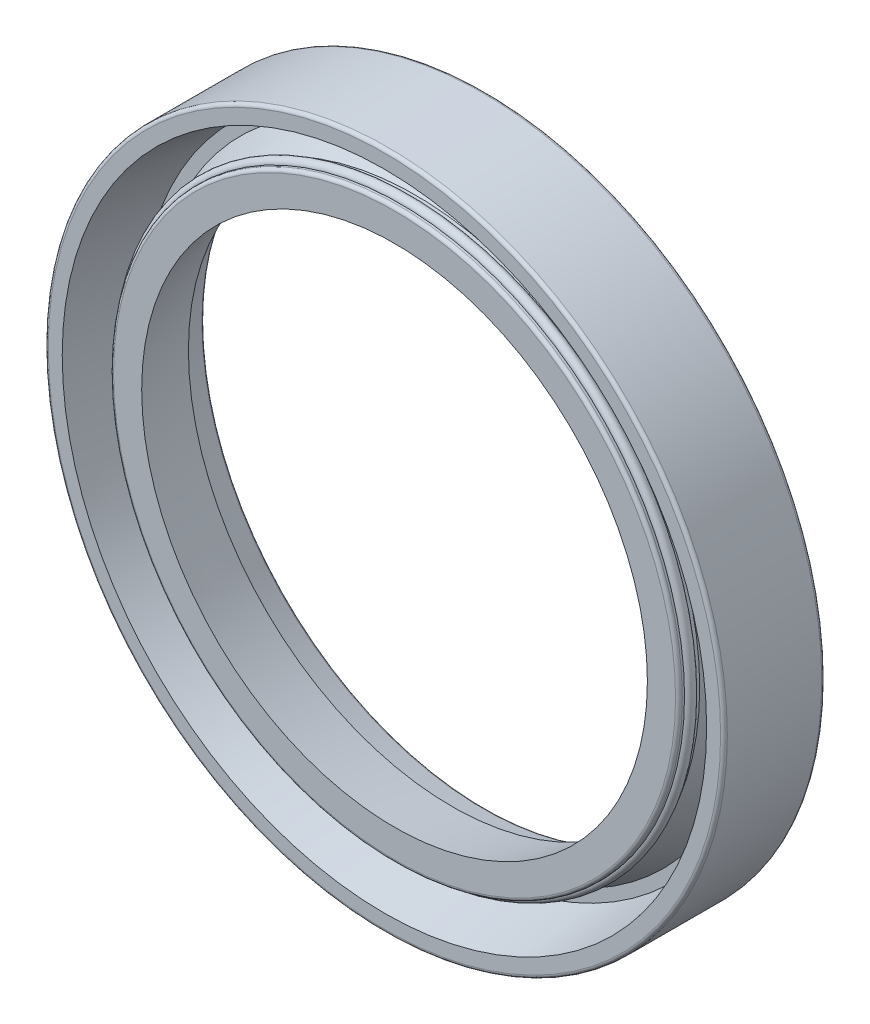
ISO-10303-21;
HEADER;
FILE_DESCRIPTION(('STEP AP214'),'2;1');
FILE_NAME('part.step','',(''),(''),'','','');
FILE_SCHEMA(('AUTOMOTIVE_DESIGN { 1 0 10303 214 1 1 1 1 }'));
ENDSEC;
DATA;
#1=APPLICATION_CONTEXT('core data for automotive mechanical design processes');
#2=APPLICATION_PROTOCOL_DEFINITION('international standard','automotive_design',2000,#1);
#3=PRODUCT_CONTEXT('',#1,'mechanical');
#4=PRODUCT('Part','Part','',(#3));
#5=PRODUCT_RELATED_PRODUCT_CATEGORY('part','',(#4));
#6=PRODUCT_DEFINITION_FORMATION('','',#4);
#7=PRODUCT_DEFINITION_CONTEXT('part definition',#1,'design');
#8=PRODUCT_DEFINITION('design','',#6,#7);
#9=PRODUCT_DEFINITION_SHAPE('','',#8);
#10=(LENGTH_UNIT() NAMED_UNIT(*) SI_UNIT(.MILLI.,.METRE.));
#11=(NAMED_UNIT(*) PLANE_ANGLE_UNIT() SI_UNIT($,.RADIAN.));
#12=(NAMED_UNIT(*) SI_UNIT($,.STERADIAN.) SOLID_ANGLE_UNIT());
#13=UNCERTAINTY_MEASURE_WITH_UNIT(LENGTH_MEASURE(1.E-05),#10,'distance_accuracy_value','');
#14=(GEOMETRIC_REPRESENTATION_CONTEXT(3) GLOBAL_UNCERTAINTY_ASSIGNED_CONTEXT((#13)) GLOBAL_UNIT_ASSIGNED_CONTEXT((#10,
#11,#12)) REPRESENTATION_CONTEXT('',''));
#15=CARTESIAN_POINT('',(0.,0.,0.));
#16=DIRECTION('',(0.,0.,1.));
#17=DIRECTION('',(1.,0.,0.));
#18=AXIS2_PLACEMENT_3D('',#15,#16,#17);
#19=CARTESIAN_POINT('',(0.,0.,-2.33333333333332));
#20=DIRECTION('',(0.,0.,1.));
#21=DIRECTION('',(1.,0.,0.));
#22=AXIS2_PLACEMENT_3D('',#19,#20,#21);
#23=CONICAL_SURFACE('',#22,21.9,0.169778273968339);
#24=CARTESIAN_POINT('',(0.,0.,-4.66666666666666));
#25=DIRECTION('',(0.,0.,-1.));
#26=DIRECTION('',(1.,0.,0.));
#27=AXIS2_PLACEMENT_3D('',#24,#25,#26);
#28=CIRCLE('',#27,21.5);
#29=CARTESIAN_POINT('',(-21.5,0.,-4.66666666666666));
#30=VERTEX_POINT('',#29);
#31=EDGE_CURVE('E28',#30,#30,#28,.T.);
#32=ORIENTED_EDGE('',*,*,#31,.T.);
#33=DIRECTION('',(-0.168963815110846,0.,0.985622254813267));
#34=VECTOR('',#33,1.);
#35=CARTESIAN_POINT('',(-21.9,0.,-2.33333333333332));
#36=LINE('',#35,#34);
#37=CARTESIAN_POINT('',(-22.3,0.,0.));
#38=VERTEX_POINT('',#37);
#39=EDGE_CURVE('E11',#30,#38,#36,.T.);
#40=ORIENTED_EDGE('',*,*,#39,.T.);
#41=CARTESIAN_POINT('',(0.,0.,0.));
#42=DIRECTION('',(0.,0.,-1.));
#43=DIRECTION('',(1.,0.,0.));
#44=AXIS2_PLACEMENT_3D('',#41,#42,#43);
#45=CIRCLE('',#44,22.3);
#46=EDGE_CURVE('E219',#38,#38,#45,.T.);
#47=ORIENTED_EDGE('',*,*,#46,.F.);
#48=ORIENTED_EDGE('',*,*,#39,.F.);
#49=EDGE_LOOP('',(#32,#40,#47,#48));
#50=FACE_BOUND('',#49,.T.);
#51=ADVANCED_FACE('F17',(#50),#23,.F.);
#52=CARTESIAN_POINT('',(21.1,0.,-4.66666666666666));
#53=DIRECTION('',(0.,0.,1.));
#54=DIRECTION('',(1.,0.,0.));
#55=AXIS2_PLACEMENT_3D('',#52,#53,#54);
#56=PLANE('',#55);
#57=CARTESIAN_POINT('',(0.,0.,-4.66666666666666));
#58=DIRECTION('',(0.,0.,-1.));
#59=DIRECTION('',(1.,0.,0.));
#60=AXIS2_PLACEMENT_3D('',#57,#58,#59);
#61=CIRCLE('',#60,20.7);
#62=CARTESIAN_POINT('',(-20.7,0.,-4.66666666666666));
#63=VERTEX_POINT('',#62);
#64=EDGE_CURVE('E221',#63,#63,#61,.T.);
#65=ORIENTED_EDGE('',*,*,#64,.T.);
#66=EDGE_LOOP('',(#65));
#67=FACE_BOUND('',#66,.T.);
#68=ORIENTED_EDGE('',*,*,#31,.F.);
#69=EDGE_LOOP('',(#68));
#70=FACE_BOUND('',#69,.T.);
#71=ADVANCED_FACE('F516',(#67,#70),#56,.T.);
#72=CARTESIAN_POINT('',(0.,0.,-3.40277777777777));
#73=DIRECTION('',(0.,0.,-1.));
#74=DIRECTION('',(1.,0.,0.));
#75=AXIS2_PLACEMENT_3D('',#72,#73,#74);
#76=CONICAL_SURFACE('',#75,20.1909090909091,0.382915430510309);
#77=ORIENTED_EDGE('',*,*,#64,.F.);
#78=DIRECTION('',(0.373626346428202,0.,0.927579297556124));
#79=VECTOR('',#78,1.);
#80=CARTESIAN_POINT('',(-20.1909090909091,0.,-3.40277777777777));
#81=LINE('',#80,#79);
#82=CARTESIAN_POINT('',(-19.6818181818182,0.,-2.13888888888888));
#83=VERTEX_POINT('',#82);
#84=EDGE_CURVE('E224',#63,#83,#81,.T.);
#85=ORIENTED_EDGE('',*,*,#84,.T.);
#86=CARTESIAN_POINT('',(0.,0.,-2.13888888888888));
#87=DIRECTION('',(0.,0.,-1.));
#88=DIRECTION('',(1.,0.,0.));
#89=AXIS2_PLACEMENT_3D('',#86,#87,#88);
#90=CIRCLE('',#89,19.6818181818182);
#91=EDGE_CURVE('E250',#83,#83,#90,.T.);
#92=ORIENTED_EDGE('',*,*,#91,.T.);
#93=ORIENTED_EDGE('',*,*,#84,.F.);
#94=EDGE_LOOP('',(#77,#85,#92,#93));
#95=FACE_BOUND('',#94,.T.);
#96=ADVANCED_FACE('F508',(#95),#76,.T.);
#97=CARTESIAN_POINT('',(0.,0.,-1.96388888888888));
#98=DIRECTION('',(0.,0.,-1.));
#99=DIRECTION('',(1.,0.,0.));
#100=AXIS2_PLACEMENT_3D('',#97,#98,#99);
#101=CYLINDRICAL_SURFACE('',#100,19.6818181818182);
#102=ORIENTED_EDGE('',*,*,#91,.F.);
#103=DIRECTION('',(0.,0.,1.));
#104=VECTOR('',#103,1.);
#105=CARTESIAN_POINT('',(-19.6818181818182,0.,-1.96388888888888));
#106=LINE('',#105,#104);
#107=CARTESIAN_POINT('',(-19.6818181818182,0.,-1.78888888888888));
#108=VERTEX_POINT('',#107);
#109=EDGE_CURVE('E225',#83,#108,#106,.T.);
#110=ORIENTED_EDGE('',*,*,#109,.T.);
#111=CARTESIAN_POINT('',(0.,0.,-1.78888888888888));
#112=DIRECTION('',(0.,0.,-1.));
#113=DIRECTION('',(1.,0.,0.));
#114=AXIS2_PLACEMENT_3D('',#111,#112,#113);
#115=CIRCLE('',#114,19.6818181818182);
#116=CARTESIAN_POINT('',(19.6818181818182,0.,-1.78888888888888));
#117=VERTEX_POINT('',#116);
#118=EDGE_CURVE('E231',#108,#117,#115,.T.);
#119=ORIENTED_EDGE('',*,*,#118,.T.);
#120=CARTESIAN_POINT('',(0.,0.,-1.78888888888888));
#121=DIRECTION('',(0.,0.,-1.));
#122=DIRECTION('',(1.,0.,0.));
#123=AXIS2_PLACEMENT_3D('',#120,#121,#122);
#124=CIRCLE('',#123,19.6818181818182);
#125=EDGE_CURVE('E218',#117,#108,#124,.T.);
#126=ORIENTED_EDGE('',*,*,#125,.T.);
#127=ORIENTED_EDGE('',*,*,#109,.F.);
#128=EDGE_LOOP('',(#102,#110,#119,#126,#127));
#129=FACE_BOUND('',#128,.T.);
#130=ADVANCED_FACE('F277',(#129),#101,.T.);
#131=CARTESIAN_POINT('',(0.,0.,-1.43888888888888));
#132=DIRECTION('',(0.,0.,-1.));
#133=DIRECTION('',(-1.,0.,0.));
#134=AXIS2_PLACEMENT_3D('',#131,#132,#133);
#135=TOROIDAL_SURFACE('',#134,19.6818181818182,0.35);
#136=ORIENTED_EDGE('',*,*,#125,.F.);
#137=CARTESIAN_POINT('',(19.6818181818182,0.,-1.43888888888888));
#138=DIRECTION('',(0.,-1.,0.));
#139=DIRECTION('',(1.,0.,0.));
#140=AXIS2_PLACEMENT_3D('',#137,#138,#139);
#141=CIRCLE('',#140,0.35);
#142=CARTESIAN_POINT('',(19.6818181818182,0.,-1.08888888888888));
#143=VERTEX_POINT('',#142);
#144=EDGE_CURVE('E149',#117,#143,#141,.T.);
#145=ORIENTED_EDGE('',*,*,#144,.T.);
#146=CARTESIAN_POINT('',(0.,0.,-1.08888888888888));
#147=DIRECTION('',(0.,0.,-1.));
#148=DIRECTION('',(1.,0.,0.));
#149=AXIS2_PLACEMENT_3D('',#146,#147,#148);
#150=CIRCLE('',#149,19.6818181818182);
#151=CARTESIAN_POINT('',(-19.6818181818182,0.,-1.08888888888888));
#152=VERTEX_POINT('',#151);
#153=EDGE_CURVE('E134',#143,#152,#150,.T.);
#154=ORIENTED_EDGE('',*,*,#153,.T.);
#155=CARTESIAN_POINT('',(0.,0.,-1.08888888888888));
#156=DIRECTION('',(0.,0.,-1.));
#157=DIRECTION('',(1.,0.,0.));
#158=AXIS2_PLACEMENT_3D('',#155,#156,#157);
#159=CIRCLE('',#158,19.6818181818182);
#160=EDGE_CURVE('E140',#152,#143,#159,.T.);
#161=ORIENTED_EDGE('',*,*,#160,.T.);
#162=ORIENTED_EDGE('',*,*,#144,.F.);
#163=ORIENTED_EDGE('',*,*,#118,.F.);
#164=EDGE_LOOP('',(#136,#145,#154,#161,#162,#163));
#165=FACE_BOUND('',#164,.T.);
#166=ADVANCED_FACE('F148',(#165),#135,.T.);
#167=CARTESIAN_POINT('',(0.,0.,-2.68333333333332));
#168=DIRECTION('',(0.,0.,-1.));
#169=DIRECTION('',(1.,0.,0.));
#170=AXIS2_PLACEMENT_3D('',#167,#168,#169);
#171=CONICAL_SURFACE('',#170,17.8666666666667,0.182809884379604);
#172=CARTESIAN_POINT('',(0.,0.,-4.66666666666665));
#173=DIRECTION('',(0.,0.,-1.));
#174=DIRECTION('',(1.,0.,0.));
#175=AXIS2_PLACEMENT_3D('',#172,#173,#174);
#176=CIRCLE('',#175,18.2333333333333);
#177=CARTESIAN_POINT('',(-18.2333333333333,0.,-4.66666666666665));
#178=VERTEX_POINT('',#177);
#179=EDGE_CURVE('E168',#178,#178,#176,.T.);
#180=ORIENTED_EDGE('',*,*,#179,.T.);
#181=DIRECTION('',(0.181793350053274,0.,0.983336757106337));
#182=VECTOR('',#181,1.);
#183=CARTESIAN_POINT('',(-17.8666666666667,0.,-2.68333333333332));
#184=LINE('',#183,#182);
#185=CARTESIAN_POINT('',(-17.5,0.,-0.699999999999988));
#186=VERTEX_POINT('',#185);
#187=EDGE_CURVE('E216',#178,#186,#184,.T.);
#188=ORIENTED_EDGE('',*,*,#187,.T.);
#189=CARTESIAN_POINT('',(0.,0.,-0.699999999999989));
#190=DIRECTION('',(0.,0.,-1.));
#191=DIRECTION('',(1.,0.,0.));
#192=AXIS2_PLACEMENT_3D('',#189,#190,#191);
#193=CIRCLE('',#192,17.5);
#194=EDGE_CURVE('E151',#186,#186,#193,.T.);
#195=ORIENTED_EDGE('',*,*,#194,.F.);
#196=ORIENTED_EDGE('',*,*,#187,.F.);
#197=EDGE_LOOP('',(#180,#188,#195,#196));
#198=FACE_BOUND('',#197,.T.);
#199=ADVANCED_FACE('F485',(#198),#171,.F.);
#200=CARTESIAN_POINT('',(22.9,0.,0.));
#201=DIRECTION('',(0.,0.,1.));
#202=DIRECTION('',(1.,0.,0.));
#203=AXIS2_PLACEMENT_3D('',#200,#201,#202);
#204=PLANE('',#203);
#205=ORIENTED_EDGE('',*,*,#46,.T.);
#206=EDGE_LOOP('',(#205));
#207=FACE_BOUND('',#206,.T.);
#208=CARTESIAN_POINT('',(0.,0.,0.));
#209=DIRECTION('',(0.,0.,-1.));
#210=DIRECTION('',(-1.,0.,0.));
#211=AXIS2_PLACEMENT_3D('',#208,#209,#210);
#212=CIRCLE('',#211,23.2666666666667);
#213=CARTESIAN_POINT('',(23.2666666666667,0.,0.));
#214=VERTEX_POINT('',#213);
#215=EDGE_CURVE('E255',#214,#214,#212,.T.);
#216=ORIENTED_EDGE('',*,*,#215,.F.);
#217=EDGE_LOOP('',(#216));
#218=FACE_BOUND('',#217,.T.);
#219=ADVANCED_FACE('F478',(#207,#218),#204,.T.);
#220=CARTESIAN_POINT('',(0.,0.,-0.233333333333323));
#221=DIRECTION('',(0.,0.,-1.));
#222=DIRECTION('',(-1.,0.,0.));
#223=AXIS2_PLACEMENT_3D('',#220,#221,#222);
#224=TOROIDAL_SURFACE('',#223,23.2666666666667,0.233333333333333);
#225=CARTESIAN_POINT('',(0.,0.,-0.233333333333323));
#226=DIRECTION('',(0.,0.,1.));
#227=DIRECTION('',(-1.,0.,0.));
#228=AXIS2_PLACEMENT_3D('',#225,#226,#227);
#229=CIRCLE('',#228,23.5);
#230=CARTESIAN_POINT('',(23.5,0.,-0.233333333333323));
#231=VERTEX_POINT('',#230);
#232=CARTESIAN_POINT('',(-23.5,0.,-0.233333333333323));
#233=VERTEX_POINT('',#232);
#234=EDGE_CURVE('E174',#231,#233,#229,.T.);
#235=ORIENTED_EDGE('',*,*,#234,.T.);
#236=CARTESIAN_POINT('',(0.,0.,-0.233333333333323));
#237=DIRECTION('',(0.,0.,1.));
#238=DIRECTION('',(-1.,0.,0.));
#239=AXIS2_PLACEMENT_3D('',#236,#237,#238);
#240=CIRCLE('',#239,23.5);
#241=EDGE_CURVE('E243',#233,#231,#240,.T.);
#242=ORIENTED_EDGE('',*,*,#241,.T.);
#243=CARTESIAN_POINT('',(23.2666666666667,0.,-0.233333333333323));
#244=DIRECTION('',(0.,-1.,0.));
#245=DIRECTION('',(1.,0.,0.));
#246=AXIS2_PLACEMENT_3D('',#243,#244,#245);
#247=CIRCLE('',#246,0.233333333333333);
#248=EDGE_CURVE('E162',#231,#214,#247,.T.);
#249=ORIENTED_EDGE('',*,*,#248,.T.);
#250=ORIENTED_EDGE('',*,*,#215,.T.);
#251=ORIENTED_EDGE('',*,*,#248,.F.);
#252=EDGE_LOOP('',(#235,#242,#249,#250,#251));
#253=FACE_BOUND('',#252,.T.);
#254=ADVANCED_FACE('F19',(#253),#224,.T.);
#255=CARTESIAN_POINT('',(0.,0.,-3.5));
#256=DIRECTION('',(0.,0.,-1.));
#257=DIRECTION('',(1.,0.,0.));
#258=AXIS2_PLACEMENT_3D('',#255,#256,#257);
#259=CYLINDRICAL_SURFACE('',#258,23.5);
#260=CARTESIAN_POINT('',(0.,0.,-6.76666666666666));
#261=DIRECTION('',(0.,0.,-1.));
#262=DIRECTION('',(-1.,0.,0.));
#263=AXIS2_PLACEMENT_3D('',#260,#261,#262);
#264=CIRCLE('',#263,23.5);
#265=CARTESIAN_POINT('',(23.5,0.,-6.76666666666666));
#266=VERTEX_POINT('',#265);
#267=CARTESIAN_POINT('',(-23.5,0.,-6.76666666666666));
#268=VERTEX_POINT('',#267);
#269=EDGE_CURVE('E215',#266,#268,#264,.T.);
#270=ORIENTED_EDGE('',*,*,#269,.F.);
#271=CARTESIAN_POINT('',(0.,0.,-6.76666666666666));
#272=DIRECTION('',(0.,0.,-1.));
#273=DIRECTION('',(-1.,0.,0.));
#274=AXIS2_PLACEMENT_3D('',#271,#272,#273);
#275=CIRCLE('',#274,23.5);
#276=EDGE_CURVE('E175',#268,#266,#275,.T.);
#277=ORIENTED_EDGE('',*,*,#276,.F.);
#278=DIRECTION('',(0.,0.,1.));
#279=VECTOR('',#278,1.);
#280=CARTESIAN_POINT('',(-23.5,0.,-3.5));
#281=LINE('',#280,#279);
#282=EDGE_CURVE('E170',#268,#233,#281,.T.);
#283=ORIENTED_EDGE('',*,*,#282,.T.);
#284=ORIENTED_EDGE('',*,*,#234,.F.);
#285=ORIENTED_EDGE('',*,*,#241,.F.);
#286=ORIENTED_EDGE('',*,*,#282,.F.);
#287=EDGE_LOOP('',(#270,#277,#283,#284,#285,#286));
#288=FACE_BOUND('',#287,.T.);
#289=ADVANCED_FACE('F461',(#288),#259,.T.);
#290=CARTESIAN_POINT('',(0.,0.,-6.76666666666666));
#291=DIRECTION('',(0.,0.,-1.));
#292=DIRECTION('',(-1.,0.,0.));
#293=AXIS2_PLACEMENT_3D('',#290,#291,#292);
#294=TOROIDAL_SURFACE('',#293,23.2666666666667,0.233333333333333);
#295=CARTESIAN_POINT('',(0.,0.,-7.));
#296=DIRECTION('',(0.,0.,1.));
#297=DIRECTION('',(-1.,0.,0.));
#298=AXIS2_PLACEMENT_3D('',#295,#296,#297);
#299=CIRCLE('',#298,23.2666666666667);
#300=CARTESIAN_POINT('',(23.2666666666667,0.,-7.));
#301=VERTEX_POINT('',#300);
#302=EDGE_CURVE('E210',#301,#301,#299,.T.);
#303=ORIENTED_EDGE('',*,*,#302,.T.);
#304=CARTESIAN_POINT('',(23.2666666666667,0.,-6.76666666666666));
#305=DIRECTION('',(0.,-1.,0.));
#306=DIRECTION('',(1.,0.,0.));
#307=AXIS2_PLACEMENT_3D('',#304,#305,#306);
#308=CIRCLE('',#307,0.233333333333333);
#309=EDGE_CURVE('E211',#301,#266,#308,.T.);
#310=ORIENTED_EDGE('',*,*,#309,.T.);
#311=ORIENTED_EDGE('',*,*,#269,.T.);
#312=ORIENTED_EDGE('',*,*,#276,.T.);
#313=ORIENTED_EDGE('',*,*,#309,.F.);
#314=EDGE_LOOP('',(#303,#310,#311,#312,#313));
#315=FACE_BOUND('',#314,.T.);
#316=ADVANCED_FACE('F452',(#315),#294,.T.);
#317=CARTESIAN_POINT('',(21.5,0.,-7.));
#318=DIRECTION('',(0.,0.,-1.));
#319=DIRECTION('',(0.,-1.,0.));
#320=AXIS2_PLACEMENT_3D('',#317,#318,#319);
#321=PLANE('',#320);
#322=CARTESIAN_POINT('',(0.,0.,-7.));
#323=DIRECTION('',(0.,0.,-1.));
#324=DIRECTION('',(-1.,0.,0.));
#325=AXIS2_PLACEMENT_3D('',#322,#323,#324);
#326=CIRCLE('',#325,19.6809241466612);
#327=CARTESIAN_POINT('',(19.6809241466612,0.,-7.));
#328=VERTEX_POINT('',#327);
#329=EDGE_CURVE('E207',#328,#328,#326,.T.);
#330=ORIENTED_EDGE('',*,*,#329,.F.);
#331=EDGE_LOOP('',(#330));
#332=FACE_BOUND('',#331,.T.);
#333=ORIENTED_EDGE('',*,*,#302,.F.);
#334=EDGE_LOOP('',(#333));
#335=FACE_BOUND('',#334,.T.);
#336=ADVANCED_FACE('F443',(#332,#335),#321,.T.);
#337=CARTESIAN_POINT('',(0.,0.,-6.76666666666666));
#338=DIRECTION('',(0.,0.,-1.));
#339=DIRECTION('',(-1.,0.,0.));
#340=AXIS2_PLACEMENT_3D('',#337,#338,#339);
#341=TOROIDAL_SURFACE('',#340,19.6809241466612,0.233333333333333);
#342=CARTESIAN_POINT('',(0.,0.,-6.82477624262247));
#343=DIRECTION('',(0.,0.,1.));
#344=DIRECTION('',(-1.,0.,0.));
#345=AXIS2_PLACEMENT_3D('',#342,#343,#344);
#346=CIRCLE('',#345,19.4549424623886);
#347=CARTESIAN_POINT('',(19.4549424623886,0.,-6.82477624262247));
#348=VERTEX_POINT('',#347);
#349=CARTESIAN_POINT('',(-19.4549424623886,0.,-6.82477624262247));
#350=VERTEX_POINT('',#349);
#351=EDGE_CURVE('E179',#348,#350,#346,.T.);
#352=ORIENTED_EDGE('',*,*,#351,.T.);
#353=CARTESIAN_POINT('',(0.,0.,-6.82477624262247));
#354=DIRECTION('',(0.,0.,1.));
#355=DIRECTION('',(-1.,0.,0.));
#356=AXIS2_PLACEMENT_3D('',#353,#354,#355);
#357=CIRCLE('',#356,19.4549424623886);
#358=EDGE_CURVE('E169',#350,#348,#357,.T.);
#359=ORIENTED_EDGE('',*,*,#358,.T.);
#360=CARTESIAN_POINT('',(19.6809241466612,0.,-6.76666666666666));
#361=DIRECTION('',(0.,-1.,0.));
#362=DIRECTION('',(1.,0.,0.));
#363=AXIS2_PLACEMENT_3D('',#360,#361,#362);
#364=CIRCLE('',#363,0.233333333333333);
#365=EDGE_CURVE('E21',#348,#328,#364,.T.);
#366=ORIENTED_EDGE('',*,*,#365,.T.);
#367=ORIENTED_EDGE('',*,*,#329,.T.);
#368=ORIENTED_EDGE('',*,*,#365,.F.);
#369=EDGE_LOOP('',(#352,#359,#366,#367,#368));
#370=FACE_BOUND('',#369,.T.);
#371=ADVANCED_FACE('F302',(#370),#341,.T.);
#372=CARTESIAN_POINT('',(0.,0.,-0.894444444444433));
#373=DIRECTION('',(0.,0.,-1.));
#374=DIRECTION('',(1.,0.,0.));
#375=AXIS2_PLACEMENT_3D('',#372,#373,#374);
#376=CYLINDRICAL_SURFACE('',#375,19.6818181818182);
#377=ORIENTED_EDGE('',*,*,#153,.F.);
#378=ORIENTED_EDGE('',*,*,#160,.F.);
#379=DIRECTION('',(0.,0.,1.));
#380=VECTOR('',#379,1.);
#381=CARTESIAN_POINT('',(-19.6818181818182,0.,-0.894444444444433));
#382=LINE('',#381,#380);
#383=CARTESIAN_POINT('',(-19.6818181818182,0.,-0.933333333333321));
#384=VERTEX_POINT('',#383);
#385=EDGE_CURVE('E130',#152,#384,#382,.T.);
#386=ORIENTED_EDGE('',*,*,#385,.T.);
#387=CARTESIAN_POINT('',(0.,0.,-0.933333333333322));
#388=DIRECTION('',(0.,0.,1.));
#389=DIRECTION('',(-1.,0.,0.));
#390=AXIS2_PLACEMENT_3D('',#387,#388,#389);
#391=CIRCLE('',#390,19.6818181818182);
#392=CARTESIAN_POINT('',(19.6818181818182,0.,-0.933333333333322));
#393=VERTEX_POINT('',#392);
#394=EDGE_CURVE('E185',#393,#384,#391,.T.);
#395=ORIENTED_EDGE('',*,*,#394,.F.);
#396=CARTESIAN_POINT('',(0.,0.,-0.933333333333322));
#397=DIRECTION('',(0.,0.,1.));
#398=DIRECTION('',(-1.,0.,0.));
#399=AXIS2_PLACEMENT_3D('',#396,#397,#398);
#400=CIRCLE('',#399,19.6818181818182);
#401=EDGE_CURVE('E137',#384,#393,#400,.T.);
#402=ORIENTED_EDGE('',*,*,#401,.F.);
#403=ORIENTED_EDGE('',*,*,#385,.F.);
#404=EDGE_LOOP('',(#377,#378,#386,#395,#402,#403));
#405=FACE_BOUND('',#404,.T.);
#406=ADVANCED_FACE('F132',(#405),#376,.T.);
#407=CARTESIAN_POINT('',(18.5909090909091,0.,-0.699999999999989));
#408=DIRECTION('',(0.,0.,1.));
#409=DIRECTION('',(1.,0.,0.));
#410=AXIS2_PLACEMENT_3D('',#407,#408,#409);
#411=PLANE('',#410);
#412=ORIENTED_EDGE('',*,*,#194,.T.);
#413=EDGE_LOOP('',(#412));
#414=FACE_BOUND('',#413,.T.);
#415=CARTESIAN_POINT('',(0.,0.,-0.699999999999989));
#416=DIRECTION('',(0.,0.,-1.));
#417=DIRECTION('',(-1.,0.,0.));
#418=AXIS2_PLACEMENT_3D('',#415,#416,#417);
#419=CIRCLE('',#418,19.4484848484848);
#420=CARTESIAN_POINT('',(19.4484848484848,0.,-0.699999999999989));
#421=VERTEX_POINT('',#420);
#422=EDGE_CURVE('E158',#421,#421,#419,.T.);
#423=ORIENTED_EDGE('',*,*,#422,.F.);
#424=EDGE_LOOP('',(#423));
#425=FACE_BOUND('',#424,.T.);
#426=ADVANCED_FACE('F413',(#414,#425),#411,.T.);
#427=CARTESIAN_POINT('',(0.,0.,-0.933333333333322));
#428=DIRECTION('',(0.,0.,-1.));
#429=DIRECTION('',(-1.,0.,0.));
#430=AXIS2_PLACEMENT_3D('',#427,#428,#429);
#431=TOROIDAL_SURFACE('',#430,19.4484848484848,0.233333333333333);
#432=ORIENTED_EDGE('',*,*,#394,.T.);
#433=ORIENTED_EDGE('',*,*,#401,.T.);
#434=CARTESIAN_POINT('',(19.4484848484848,0.,-0.933333333333322));
#435=DIRECTION('',(0.,-1.,0.));
#436=DIRECTION('',(1.,0.,0.));
#437=AXIS2_PLACEMENT_3D('',#434,#435,#436);
#438=CIRCLE('',#437,0.233333333333333);
#439=EDGE_CURVE('E184',#393,#421,#438,.T.);
#440=ORIENTED_EDGE('',*,*,#439,.T.);
#441=ORIENTED_EDGE('',*,*,#422,.T.);
#442=ORIENTED_EDGE('',*,*,#439,.F.);
#443=EDGE_LOOP('',(#432,#433,#440,#441,#442));
#444=FACE_BOUND('',#443,.T.);
#445=ADVANCED_FACE('F402',(#444),#431,.T.);
#446=CARTESIAN_POINT('',(18.5666666666667,0.,-4.66666666666665));
#447=DIRECTION('',(0.,0.,-1.));
#448=DIRECTION('',(0.,-1.,0.));
#449=AXIS2_PLACEMENT_3D('',#446,#447,#448);
#450=PLANE('',#449);
#451=ORIENTED_EDGE('',*,*,#179,.F.);
#452=EDGE_LOOP('',(#451));
#453=FACE_BOUND('',#452,.T.);
#454=CARTESIAN_POINT('',(0.,0.,-4.66666666666665));
#455=DIRECTION('',(0.,0.,1.));
#456=DIRECTION('',(-1.,0.,0.));
#457=AXIS2_PLACEMENT_3D('',#454,#455,#456);
#458=CIRCLE('',#457,18.7190758533388);
#459=CARTESIAN_POINT('',(18.7190758533388,0.,-4.66666666666665));
#460=VERTEX_POINT('',#459);
#461=EDGE_CURVE('E180',#460,#460,#458,.T.);
#462=ORIENTED_EDGE('',*,*,#461,.F.);
#463=EDGE_LOOP('',(#462));
#464=FACE_BOUND('',#463,.T.);
#465=ADVANCED_FACE('F392',(#453,#464),#450,.T.);
#466=CARTESIAN_POINT('',(0.,0.,-5.83333333333332));
#467=DIRECTION('',(0.,0.,-1.));
#468=DIRECTION('',(1.,0.,0.));
#469=AXIS2_PLACEMENT_3D('',#466,#467,#468);
#470=CONICAL_SURFACE('',#469,19.2,0.251689971758186);
#471=ORIENTED_EDGE('',*,*,#351,.F.);
#472=ORIENTED_EDGE('',*,*,#358,.F.);
#473=DIRECTION('',(0.249041039810618,0.,0.96849293259685));
#474=VECTOR('',#473,1.);
#475=CARTESIAN_POINT('',(-19.2,0.,-5.83333333333332));
#476=LINE('',#475,#474);
#477=CARTESIAN_POINT('',(-18.9450575376114,0.,-4.84189042404417));
#478=VERTEX_POINT('',#477);
#479=EDGE_CURVE('E164',#350,#478,#476,.T.);
#480=ORIENTED_EDGE('',*,*,#479,.T.);
#481=CARTESIAN_POINT('',(0.,0.,-4.84189042404417));
#482=DIRECTION('',(0.,0.,-1.));
#483=DIRECTION('',(-1.,0.,0.));
#484=AXIS2_PLACEMENT_3D('',#481,#482,#483);
#485=CIRCLE('',#484,18.9450575376114);
#486=CARTESIAN_POINT('',(18.9450575376114,0.,-4.84189042404417));
#487=VERTEX_POINT('',#486);
#488=EDGE_CURVE('E202',#487,#478,#485,.T.);
#489=ORIENTED_EDGE('',*,*,#488,.F.);
#490=CARTESIAN_POINT('',(0.,0.,-4.84189042404417));
#491=DIRECTION('',(0.,0.,-1.));
#492=DIRECTION('',(-1.,0.,0.));
#493=AXIS2_PLACEMENT_3D('',#490,#491,#492);
#494=CIRCLE('',#493,18.9450575376114);
#495=EDGE_CURVE('E206',#478,#487,#494,.T.);
#496=ORIENTED_EDGE('',*,*,#495,.F.);
#497=ORIENTED_EDGE('',*,*,#479,.F.);
#498=EDGE_LOOP('',(#471,#472,#480,#489,#496,#497));
#499=FACE_BOUND('',#498,.T.);
#500=ADVANCED_FACE('F299',(#499),#470,.F.);
#501=CARTESIAN_POINT('',(0.,0.,-4.9));
#502=DIRECTION('',(0.,0.,-1.));
#503=DIRECTION('',(-1.,0.,0.));
#504=AXIS2_PLACEMENT_3D('',#501,#502,#503);
#505=TOROIDAL_SURFACE('',#504,18.7190758533388,0.233333333333333);
#506=ORIENTED_EDGE('',*,*,#488,.T.);
#507=ORIENTED_EDGE('',*,*,#495,.T.);
#508=CARTESIAN_POINT('',(18.7190758533388,0.,-4.9));
#509=DIRECTION('',(0.,-1.,0.));
#510=DIRECTION('',(1.,0.,0.));
#511=AXIS2_PLACEMENT_3D('',#508,#509,#510);
#512=CIRCLE('',#511,0.233333333333333);
#513=EDGE_CURVE('E182',#487,#460,#512,.T.);
#514=ORIENTED_EDGE('',*,*,#513,.T.);
#515=ORIENTED_EDGE('',*,*,#461,.T.);
#516=ORIENTED_EDGE('',*,*,#513,.F.);
#517=EDGE_LOOP('',(#506,#507,#514,#515,#516));
#518=FACE_BOUND('',#517,.T.);
#519=ADVANCED_FACE('F292',(#518),#505,.F.);
#520=CLOSED_SHELL('',(#51,#71,#96,#130,#166,#199,#219,#254,#289,#316,#336,#371,#406,#426,#445,
#465,#500,#519));
#521=MANIFOLD_SOLID_BREP('B1',#520);
#522=ADVANCED_BREP_SHAPE_REPRESENTATION('',(#18,#521),#14);
#523=SHAPE_DEFINITION_REPRESENTATION(#9,#522);
ENDSEC;
END-ISO-10303-21;
